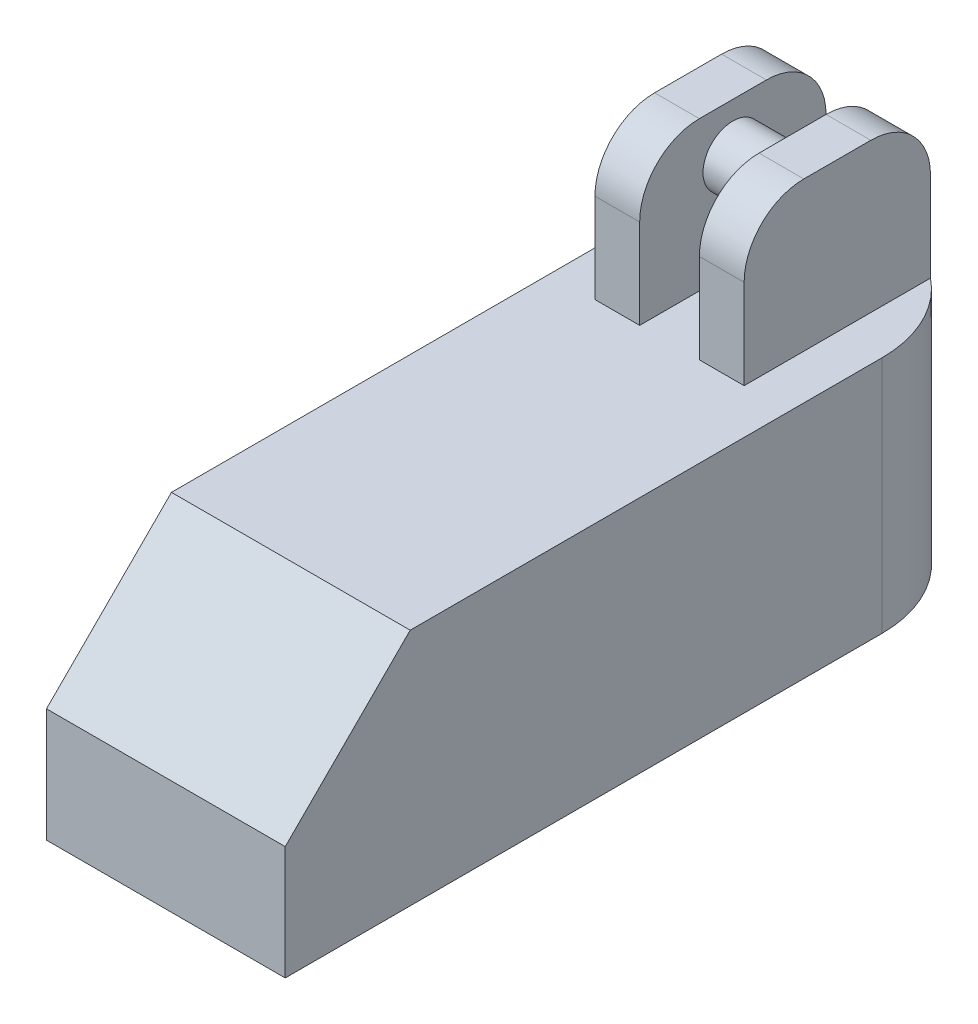
ISO-10303-21;
HEADER;
FILE_DESCRIPTION(('STEP AP214'),'2;1');
FILE_NAME('part.step','',(''),(''),'','','');
FILE_SCHEMA(('AUTOMOTIVE_DESIGN { 1 0 10303 214 1 1 1 1 }'));
ENDSEC;
DATA;
#1=APPLICATION_CONTEXT('core data for automotive mechanical design processes');
#2=APPLICATION_PROTOCOL_DEFINITION('international standard','automotive_design',2000,#1);
#3=PRODUCT_CONTEXT('',#1,'mechanical');
#4=PRODUCT('Part','Part','',(#3));
#5=PRODUCT_RELATED_PRODUCT_CATEGORY('part','',(#4));
#6=PRODUCT_DEFINITION_FORMATION('','',#4);
#7=PRODUCT_DEFINITION_CONTEXT('part definition',#1,'design');
#8=PRODUCT_DEFINITION('design','',#6,#7);
#9=PRODUCT_DEFINITION_SHAPE('','',#8);
#10=(LENGTH_UNIT() NAMED_UNIT(*) SI_UNIT(.MILLI.,.METRE.));
#11=(NAMED_UNIT(*) PLANE_ANGLE_UNIT() SI_UNIT($,.RADIAN.));
#12=(NAMED_UNIT(*) SI_UNIT($,.STERADIAN.) SOLID_ANGLE_UNIT());
#13=UNCERTAINTY_MEASURE_WITH_UNIT(LENGTH_MEASURE(1.E-05),#10,'distance_accuracy_value','');
#14=(GEOMETRIC_REPRESENTATION_CONTEXT(3) GLOBAL_UNCERTAINTY_ASSIGNED_CONTEXT((#13)) GLOBAL_UNIT_ASSIGNED_CONTEXT((#10,
#11,#12)) REPRESENTATION_CONTEXT('',''));
#15=CARTESIAN_POINT('',(0.,0.,0.));
#16=DIRECTION('',(0.,0.,1.));
#17=DIRECTION('',(1.,0.,0.));
#18=AXIS2_PLACEMENT_3D('',#15,#16,#17);
#19=CARTESIAN_POINT('',(0.,203.2,0.));
#20=DIRECTION('',(0.,-1.,0.));
#21=DIRECTION('',(0.,0.,-1.));
#22=AXIS2_PLACEMENT_3D('',#19,#20,#21);
#23=CYLINDRICAL_SURFACE('',#22,50.8);
#24=CARTESIAN_POINT('',(0.,101.6,0.));
#25=DIRECTION('',(0.,1.,0.));
#26=DIRECTION('',(0.,0.,1.));
#27=AXIS2_PLACEMENT_3D('',#24,#25,#26);
#28=CIRCLE('',#27,50.8);
#29=CARTESIAN_POINT('',(50.8,101.6,0.));
#30=VERTEX_POINT('',#29);
#31=CARTESIAN_POINT('',(-50.8,101.6,0.));
#32=VERTEX_POINT('',#31);
#33=EDGE_CURVE('E166',#30,#32,#28,.T.);
#34=ORIENTED_EDGE('',*,*,#33,.T.);
#35=DIRECTION('',(0.,-1.,0.));
#36=VECTOR('',#35,1.);
#37=CARTESIAN_POINT('',(-50.8,203.2,0.));
#38=LINE('',#37,#36);
#39=CARTESIAN_POINT('',(-50.8,203.2,0.));
#40=VERTEX_POINT('',#39);
#41=EDGE_CURVE('E170',#40,#32,#38,.T.);
#42=ORIENTED_EDGE('',*,*,#41,.F.);
#43=CARTESIAN_POINT('',(0.,203.2,0.));
#44=DIRECTION('',(0.,1.,0.));
#45=DIRECTION('',(0.,0.,1.));
#46=AXIS2_PLACEMENT_3D('',#43,#44,#45);
#47=CIRCLE('',#46,50.8);
#48=CARTESIAN_POINT('',(-31.75,203.2,-39.6557372898298));
#49=VERTEX_POINT('',#48);
#50=EDGE_CURVE('E250',#49,#40,#47,.T.);
#51=ORIENTED_EDGE('',*,*,#50,.F.);
#52=CARTESIAN_POINT('',(31.75,203.2,-39.6557372898298));
#53=VERTEX_POINT('',#52);
#54=EDGE_CURVE('E255',#53,#49,#47,.T.);
#55=ORIENTED_EDGE('',*,*,#54,.F.);
#56=CARTESIAN_POINT('',(50.8,203.2,0.));
#57=VERTEX_POINT('',#56);
#58=EDGE_CURVE('E251',#57,#53,#47,.T.);
#59=ORIENTED_EDGE('',*,*,#58,.F.);
#60=DIRECTION('',(0.,1.,0.));
#61=VECTOR('',#60,1.);
#62=CARTESIAN_POINT('',(50.8,203.2,0.));
#63=LINE('',#62,#61);
#64=EDGE_CURVE('E174',#30,#57,#63,.T.);
#65=ORIENTED_EDGE('',*,*,#64,.F.);
#66=EDGE_LOOP('',(#34,#42,#51,#55,#59,#65));
#67=FACE_BOUND('',#66,.T.);
#68=ADVANCED_FACE('F47',(#67),#23,.T.);
#69=CARTESIAN_POINT('',(-31.75,266.7,-39.6557372898298));
#70=DIRECTION('',(0.,0.,1.));
#71=DIRECTION('',(1.,0.,0.));
#72=AXIS2_PLACEMENT_3D('',#69,#70,#71);
#73=PLANE('',#72);
#74=DIRECTION('',(0.,1.,0.));
#75=VECTOR('',#74,1.);
#76=CARTESIAN_POINT('',(12.7,203.2,-39.6557372898298));
#77=LINE('',#76,#75);
#78=CARTESIAN_POINT('',(12.7,203.2,-39.6557372898298));
#79=VERTEX_POINT('',#78);
#80=CARTESIAN_POINT('',(12.7,241.3,-39.6557372898298));
#81=VERTEX_POINT('',#80);
#82=EDGE_CURVE('E206',#79,#81,#77,.T.);
#83=ORIENTED_EDGE('',*,*,#82,.T.);
#84=DIRECTION('',(-1.,0.,0.));
#85=VECTOR('',#84,1.);
#86=CARTESIAN_POINT('',(-31.75,241.3,-39.6557372898298));
#87=LINE('',#86,#85);
#88=CARTESIAN_POINT('',(31.75,241.3,-39.6557372898298));
#89=VERTEX_POINT('',#88);
#90=EDGE_CURVE('E283',#81,#89,#87,.F.);
#91=ORIENTED_EDGE('',*,*,#90,.T.);
#92=DIRECTION('',(0.,-1.,0.));
#93=VECTOR('',#92,1.);
#94=CARTESIAN_POINT('',(31.75,266.7,-39.6557372898298));
#95=LINE('',#94,#93);
#96=EDGE_CURVE('E247',#89,#53,#95,.T.);
#97=ORIENTED_EDGE('',*,*,#96,.T.);
#98=DIRECTION('',(-1.,0.,0.));
#99=VECTOR('',#98,1.);
#100=CARTESIAN_POINT('',(-31.75,203.2,-39.6557372898298));
#101=LINE('',#100,#99);
#102=EDGE_CURVE('E233',#53,#79,#101,.T.);
#103=ORIENTED_EDGE('',*,*,#102,.T.);
#104=EDGE_LOOP('',(#83,#91,#97,#103));
#105=FACE_BOUND('',#104,.T.);
#106=ADVANCED_FACE('F359',(#105),#73,.F.);
#107=CARTESIAN_POINT('',(-31.75,266.7,39.6557372898298));
#108=DIRECTION('',(0.,0.,-1.));
#109=DIRECTION('',(-1.,0.,0.));
#110=AXIS2_PLACEMENT_3D('',#107,#108,#109);
#111=PLANE('',#110);
#112=DIRECTION('',(0.,-1.,0.));
#113=VECTOR('',#112,1.);
#114=CARTESIAN_POINT('',(31.75,266.7,39.6557372898298));
#115=LINE('',#114,#113);
#116=CARTESIAN_POINT('',(31.75,241.3,39.6557372898298));
#117=VERTEX_POINT('',#116);
#118=CARTESIAN_POINT('',(31.75,203.2,39.6557372898298));
#119=VERTEX_POINT('',#118);
#120=EDGE_CURVE('E230',#117,#119,#115,.T.);
#121=ORIENTED_EDGE('',*,*,#120,.F.);
#122=DIRECTION('',(1.,0.,0.));
#123=VECTOR('',#122,1.);
#124=CARTESIAN_POINT('',(-31.75,241.3,39.6557372898298));
#125=LINE('',#124,#123);
#126=CARTESIAN_POINT('',(12.7,241.3,39.6557372898298));
#127=VERTEX_POINT('',#126);
#128=EDGE_CURVE('E289',#117,#127,#125,.F.);
#129=ORIENTED_EDGE('',*,*,#128,.T.);
#130=DIRECTION('',(0.,1.,0.));
#131=VECTOR('',#130,1.);
#132=CARTESIAN_POINT('',(12.7,203.2,39.6557372898298));
#133=LINE('',#132,#131);
#134=CARTESIAN_POINT('',(12.7,203.2,39.6557372898298));
#135=VERTEX_POINT('',#134);
#136=EDGE_CURVE('E211',#135,#127,#133,.T.);
#137=ORIENTED_EDGE('',*,*,#136,.F.);
#138=DIRECTION('',(1.,0.,0.));
#139=VECTOR('',#138,1.);
#140=CARTESIAN_POINT('',(-31.75,203.2,39.6557372898298));
#141=LINE('',#140,#139);
#142=EDGE_CURVE('E238',#135,#119,#141,.T.);
#143=ORIENTED_EDGE('',*,*,#142,.T.);
#144=EDGE_LOOP('',(#121,#129,#137,#143));
#145=FACE_BOUND('',#144,.T.);
#146=ADVANCED_FACE('F348',(#145),#111,.F.);
#147=CARTESIAN_POINT('',(0.,266.7,0.));
#148=DIRECTION('',(0.,-1.,0.));
#149=DIRECTION('',(0.,0.,-1.));
#150=AXIS2_PLACEMENT_3D('',#147,#148,#149);
#151=PLANE('',#150);
#152=DIRECTION('',(0.,0.,-1.));
#153=VECTOR('',#152,1.);
#154=CARTESIAN_POINT('',(31.75,266.7,39.6557372898298));
#155=LINE('',#154,#153);
#156=CARTESIAN_POINT('',(31.75,266.7,14.2557372898298));
#157=VERTEX_POINT('',#156);
#158=CARTESIAN_POINT('',(31.75,266.7,-14.2557372898298));
#159=VERTEX_POINT('',#158);
#160=EDGE_CURVE('E223',#157,#159,#155,.T.);
#161=ORIENTED_EDGE('',*,*,#160,.T.);
#162=DIRECTION('',(-1.,0.,0.));
#163=VECTOR('',#162,1.);
#164=CARTESIAN_POINT('',(0.,266.7,-14.2557372898298));
#165=LINE('',#164,#163);
#166=CARTESIAN_POINT('',(12.7,266.7,-14.2557372898298));
#167=VERTEX_POINT('',#166);
#168=EDGE_CURVE('E276',#159,#167,#165,.T.);
#169=ORIENTED_EDGE('',*,*,#168,.T.);
#170=DIRECTION('',(0.,0.,-1.));
#171=VECTOR('',#170,1.);
#172=CARTESIAN_POINT('',(12.7,266.7,39.6557372898298));
#173=LINE('',#172,#171);
#174=CARTESIAN_POINT('',(12.7,266.7,14.2557372898298));
#175=VERTEX_POINT('',#174);
#176=EDGE_CURVE('E185',#175,#167,#173,.T.);
#177=ORIENTED_EDGE('',*,*,#176,.F.);
#178=DIRECTION('',(1.,0.,0.));
#179=VECTOR('',#178,1.);
#180=CARTESIAN_POINT('',(0.,266.7,14.2557372898298));
#181=LINE('',#180,#179);
#182=EDGE_CURVE('E273',#175,#157,#181,.T.);
#183=ORIENTED_EDGE('',*,*,#182,.T.);
#184=EDGE_LOOP('',(#161,#169,#177,#183));
#185=FACE_BOUND('',#184,.T.);
#186=ADVANCED_FACE('F336',(#185),#151,.F.);
#187=CARTESIAN_POINT('',(0.,203.2,0.));
#188=DIRECTION('',(0.,1.,0.));
#189=DIRECTION('',(0.,0.,1.));
#190=AXIS2_PLACEMENT_3D('',#187,#188,#189);
#191=PLANE('',#190);
#192=DIRECTION('',(0.,0.,-1.));
#193=VECTOR('',#192,1.);
#194=CARTESIAN_POINT('',(-50.8,203.2,254.));
#195=LINE('',#194,#193);
#196=CARTESIAN_POINT('',(-50.8,203.2,200.82));
#197=VERTEX_POINT('',#196);
#198=EDGE_CURVE('E189',#197,#40,#195,.T.);
#199=ORIENTED_EDGE('',*,*,#198,.F.);
#200=DIRECTION('',(1.,0.,0.));
#201=VECTOR('',#200,1.);
#202=CARTESIAN_POINT('',(0.,203.2,200.82));
#203=LINE('',#202,#201);
#204=CARTESIAN_POINT('',(50.8,203.2,200.82));
#205=VERTEX_POINT('',#204);
#206=EDGE_CURVE('E57',#197,#205,#203,.T.);
#207=ORIENTED_EDGE('',*,*,#206,.T.);
#208=DIRECTION('',(0.,0.,-1.));
#209=VECTOR('',#208,1.);
#210=CARTESIAN_POINT('',(50.8,203.2,254.));
#211=LINE('',#210,#209);
#212=EDGE_CURVE('E198',#205,#57,#211,.T.);
#213=ORIENTED_EDGE('',*,*,#212,.T.);
#214=ORIENTED_EDGE('',*,*,#58,.T.);
#215=DIRECTION('',(0.,0.,-1.));
#216=VECTOR('',#215,1.);
#217=CARTESIAN_POINT('',(31.75,203.2,39.6557372898298));
#218=LINE('',#217,#216);
#219=EDGE_CURVE('E214',#119,#53,#218,.T.);
#220=ORIENTED_EDGE('',*,*,#219,.F.);
#221=ORIENTED_EDGE('',*,*,#142,.F.);
#222=DIRECTION('',(0.,0.,-1.));
#223=VECTOR('',#222,1.);
#224=CARTESIAN_POINT('',(12.7,203.2,39.6557372898298));
#225=LINE('',#224,#223);
#226=EDGE_CURVE('E201',#135,#79,#225,.T.);
#227=ORIENTED_EDGE('',*,*,#226,.T.);
#228=ORIENTED_EDGE('',*,*,#102,.F.);
#229=ORIENTED_EDGE('',*,*,#54,.T.);
#230=CARTESIAN_POINT('',(-12.7,203.2,-39.6557372898298));
#231=VERTEX_POINT('',#230);
#232=EDGE_CURVE('E232',#231,#49,#101,.T.);
#233=ORIENTED_EDGE('',*,*,#232,.F.);
#234=DIRECTION('',(0.,0.,1.));
#235=VECTOR('',#234,1.);
#236=CARTESIAN_POINT('',(-12.7,203.2,39.6557372898298));
#237=LINE('',#236,#235);
#238=CARTESIAN_POINT('',(-12.7,203.2,39.6557372898298));
#239=VERTEX_POINT('',#238);
#240=EDGE_CURVE('E203',#231,#239,#237,.T.);
#241=ORIENTED_EDGE('',*,*,#240,.T.);
#242=CARTESIAN_POINT('',(-31.75,203.2,39.6557372898298));
#243=VERTEX_POINT('',#242);
#244=EDGE_CURVE('E227',#243,#239,#141,.T.);
#245=ORIENTED_EDGE('',*,*,#244,.F.);
#246=DIRECTION('',(0.,0.,1.));
#247=VECTOR('',#246,1.);
#248=CARTESIAN_POINT('',(-31.75,203.2,39.6557372898298));
#249=LINE('',#248,#247);
#250=EDGE_CURVE('E236',#49,#243,#249,.T.);
#251=ORIENTED_EDGE('',*,*,#250,.F.);
#252=ORIENTED_EDGE('',*,*,#50,.T.);
#253=EDGE_LOOP('',(#199,#207,#213,#214,#220,#221,#227,#228,#229,#233,#241,#245,#251,#252));
#254=FACE_BOUND('',#253,.T.);
#255=ADVANCED_FACE('F352',(#254),#191,.T.);
#256=CARTESIAN_POINT('',(31.75,266.7,39.6557372898298));
#257=DIRECTION('',(-1.,0.,0.));
#258=DIRECTION('',(0.,0.,1.));
#259=AXIS2_PLACEMENT_3D('',#256,#257,#258);
#260=PLANE('',#259);
#261=ORIENTED_EDGE('',*,*,#96,.F.);
#262=CARTESIAN_POINT('',(31.75,241.3,-14.2557372898298));
#263=DIRECTION('',(-1.,0.,0.));
#264=DIRECTION('',(0.,0.,1.));
#265=AXIS2_PLACEMENT_3D('',#262,#263,#264);
#266=CIRCLE('',#265,25.4);
#267=EDGE_CURVE('E287',#89,#159,#266,.F.);
#268=ORIENTED_EDGE('',*,*,#267,.T.);
#269=ORIENTED_EDGE('',*,*,#160,.F.);
#270=CARTESIAN_POINT('',(31.75,241.3,14.2557372898298));
#271=DIRECTION('',(-1.,0.,0.));
#272=DIRECTION('',(0.,0.,1.));
#273=AXIS2_PLACEMENT_3D('',#270,#271,#272);
#274=CIRCLE('',#273,25.4);
#275=EDGE_CURVE('E285',#157,#117,#274,.F.);
#276=ORIENTED_EDGE('',*,*,#275,.T.);
#277=ORIENTED_EDGE('',*,*,#120,.T.);
#278=ORIENTED_EDGE('',*,*,#219,.T.);
#279=EDGE_LOOP('',(#261,#268,#269,#276,#277,#278));
#280=FACE_BOUND('',#279,.T.);
#281=ADVANCED_FACE('F345',(#280),#260,.F.);
#282=DIRECTION('',(0.,-1.,0.));
#283=VECTOR('',#282,1.);
#284=CARTESIAN_POINT('',(-31.75,266.7,-39.6557372898298));
#285=LINE('',#284,#283);
#286=CARTESIAN_POINT('',(-31.75,241.3,-39.6557372898298));
#287=VERTEX_POINT('',#286);
#288=EDGE_CURVE('E245',#287,#49,#285,.T.);
#289=ORIENTED_EDGE('',*,*,#288,.F.);
#290=DIRECTION('',(-1.,0.,0.));
#291=VECTOR('',#290,1.);
#292=CARTESIAN_POINT('',(-31.75,241.3,-39.6557372898298));
#293=LINE('',#292,#291);
#294=CARTESIAN_POINT('',(-12.7,241.3,-39.6557372898298));
#295=VERTEX_POINT('',#294);
#296=EDGE_CURVE('E265',#287,#295,#293,.F.);
#297=ORIENTED_EDGE('',*,*,#296,.T.);
#298=DIRECTION('',(0.,1.,0.));
#299=VECTOR('',#298,1.);
#300=CARTESIAN_POINT('',(-12.7,203.2,-39.6557372898298));
#301=LINE('',#300,#299);
#302=EDGE_CURVE('E218',#231,#295,#301,.T.);
#303=ORIENTED_EDGE('',*,*,#302,.F.);
#304=ORIENTED_EDGE('',*,*,#232,.T.);
#305=EDGE_LOOP('',(#289,#297,#303,#304));
#306=FACE_BOUND('',#305,.T.);
#307=ADVANCED_FACE('F387',(#306),#73,.F.);
#308=CARTESIAN_POINT('',(-31.75,266.7,39.6557372898298));
#309=DIRECTION('',(1.,0.,0.));
#310=DIRECTION('',(0.,0.,-1.));
#311=AXIS2_PLACEMENT_3D('',#308,#309,#310);
#312=PLANE('',#311);
#313=DIRECTION('',(0.,0.,1.));
#314=VECTOR('',#313,1.);
#315=CARTESIAN_POINT('',(-31.75,266.7,39.6557372898298));
#316=LINE('',#315,#314);
#317=CARTESIAN_POINT('',(-31.75,266.7,-14.2557372898298));
#318=VERTEX_POINT('',#317);
#319=CARTESIAN_POINT('',(-31.75,266.7,14.2557372898298));
#320=VERTEX_POINT('',#319);
#321=EDGE_CURVE('E226',#318,#320,#316,.T.);
#322=ORIENTED_EDGE('',*,*,#321,.F.);
#323=CARTESIAN_POINT('',(-31.75,241.3,-14.2557372898298));
#324=DIRECTION('',(1.,0.,0.));
#325=DIRECTION('',(0.,0.,-1.));
#326=AXIS2_PLACEMENT_3D('',#323,#324,#325);
#327=CIRCLE('',#326,25.4);
#328=EDGE_CURVE('E263',#318,#287,#327,.F.);
#329=ORIENTED_EDGE('',*,*,#328,.T.);
#330=ORIENTED_EDGE('',*,*,#288,.T.);
#331=ORIENTED_EDGE('',*,*,#250,.T.);
#332=DIRECTION('',(0.,-1.,0.));
#333=VECTOR('',#332,1.);
#334=CARTESIAN_POINT('',(-31.75,266.7,39.6557372898298));
#335=LINE('',#334,#333);
#336=CARTESIAN_POINT('',(-31.75,241.3,39.6557372898298));
#337=VERTEX_POINT('',#336);
#338=EDGE_CURVE('E242',#337,#243,#335,.T.);
#339=ORIENTED_EDGE('',*,*,#338,.F.);
#340=CARTESIAN_POINT('',(-31.75,241.3,14.2557372898298));
#341=DIRECTION('',(1.,0.,0.));
#342=DIRECTION('',(0.,0.,-1.));
#343=AXIS2_PLACEMENT_3D('',#340,#341,#342);
#344=CIRCLE('',#343,25.4);
#345=EDGE_CURVE('E261',#337,#320,#344,.F.);
#346=ORIENTED_EDGE('',*,*,#345,.T.);
#347=EDGE_LOOP('',(#322,#329,#330,#331,#339,#346));
#348=FACE_BOUND('',#347,.T.);
#349=ADVANCED_FACE('F368',(#348),#312,.F.);
#350=DIRECTION('',(0.,1.,0.));
#351=VECTOR('',#350,1.);
#352=CARTESIAN_POINT('',(-12.7,203.2,39.6557372898298));
#353=LINE('',#352,#351);
#354=CARTESIAN_POINT('',(-12.7,241.3,39.6557372898298));
#355=VERTEX_POINT('',#354);
#356=EDGE_CURVE('E215',#239,#355,#353,.T.);
#357=ORIENTED_EDGE('',*,*,#356,.T.);
#358=DIRECTION('',(1.,0.,0.));
#359=VECTOR('',#358,1.);
#360=CARTESIAN_POINT('',(-31.75,241.3,39.6557372898298));
#361=LINE('',#360,#359);
#362=EDGE_CURVE('E271',#355,#337,#361,.F.);
#363=ORIENTED_EDGE('',*,*,#362,.T.);
#364=ORIENTED_EDGE('',*,*,#338,.T.);
#365=ORIENTED_EDGE('',*,*,#244,.T.);
#366=EDGE_LOOP('',(#357,#363,#364,#365));
#367=FACE_BOUND('',#366,.T.);
#368=ADVANCED_FACE('F373',(#367),#111,.F.);
#369=DIRECTION('',(0.,0.,1.));
#370=VECTOR('',#369,1.);
#371=CARTESIAN_POINT('',(-12.7,266.7,39.6557372898298));
#372=LINE('',#371,#370);
#373=CARTESIAN_POINT('',(-12.7,266.7,-14.2557372898298));
#374=VERTEX_POINT('',#373);
#375=CARTESIAN_POINT('',(-12.7,266.7,14.2557372898298));
#376=VERTEX_POINT('',#375);
#377=EDGE_CURVE('E204',#374,#376,#372,.T.);
#378=ORIENTED_EDGE('',*,*,#377,.F.);
#379=DIRECTION('',(-1.,0.,0.));
#380=VECTOR('',#379,1.);
#381=CARTESIAN_POINT('',(0.,266.7,-14.2557372898298));
#382=LINE('',#381,#380);
#383=EDGE_CURVE('E258',#374,#318,#382,.T.);
#384=ORIENTED_EDGE('',*,*,#383,.T.);
#385=ORIENTED_EDGE('',*,*,#321,.T.);
#386=DIRECTION('',(1.,0.,0.));
#387=VECTOR('',#386,1.);
#388=CARTESIAN_POINT('',(0.,266.7,14.2557372898298));
#389=LINE('',#388,#387);
#390=EDGE_CURVE('E254',#320,#376,#389,.T.);
#391=ORIENTED_EDGE('',*,*,#390,.T.);
#392=EDGE_LOOP('',(#378,#384,#385,#391));
#393=FACE_BOUND('',#392,.T.);
#394=ADVANCED_FACE('F329',(#393),#151,.F.);
#395=CARTESIAN_POINT('',(12.7,203.2,39.6557372898298));
#396=DIRECTION('',(1.,0.,0.));
#397=DIRECTION('',(0.,0.,-1.));
#398=AXIS2_PLACEMENT_3D('',#395,#396,#397);
#399=PLANE('',#398);
#400=CARTESIAN_POINT('',(12.7,245.99349704648,0.));
#401=DIRECTION('',(1.,0.,0.));
#402=DIRECTION('',(0.,0.,-1.));
#403=AXIS2_PLACEMENT_3D('',#400,#401,#402);
#404=CIRCLE('',#403,12.7);
#405=CARTESIAN_POINT('',(12.7,245.99349704648,-12.7));
#406=VERTEX_POINT('',#405);
#407=EDGE_CURVE('E178',#406,#406,#404,.T.);
#408=ORIENTED_EDGE('',*,*,#407,.T.);
#409=EDGE_LOOP('',(#408));
#410=FACE_BOUND('',#409,.T.);
#411=ORIENTED_EDGE('',*,*,#176,.T.);
#412=CARTESIAN_POINT('',(12.7,241.3,-14.2557372898298));
#413=DIRECTION('',(1.,0.,0.));
#414=DIRECTION('',(0.,0.,-1.));
#415=AXIS2_PLACEMENT_3D('',#412,#413,#414);
#416=CIRCLE('',#415,25.4);
#417=EDGE_CURVE('E281',#167,#81,#416,.F.);
#418=ORIENTED_EDGE('',*,*,#417,.T.);
#419=ORIENTED_EDGE('',*,*,#82,.F.);
#420=ORIENTED_EDGE('',*,*,#226,.F.);
#421=ORIENTED_EDGE('',*,*,#136,.T.);
#422=CARTESIAN_POINT('',(12.7,241.3,14.2557372898298));
#423=DIRECTION('',(1.,0.,0.));
#424=DIRECTION('',(0.,0.,-1.));
#425=AXIS2_PLACEMENT_3D('',#422,#423,#424);
#426=CIRCLE('',#425,25.4);
#427=EDGE_CURVE('E279',#127,#175,#426,.F.);
#428=ORIENTED_EDGE('',*,*,#427,.T.);
#429=EDGE_LOOP('',(#411,#418,#419,#420,#421,#428));
#430=FACE_BOUND('',#429,.T.);
#431=ADVANCED_FACE('F326',(#410,#430),#399,.F.);
#432=CARTESIAN_POINT('',(-12.7,203.2,39.6557372898298));
#433=DIRECTION('',(-1.,0.,0.));
#434=DIRECTION('',(0.,0.,1.));
#435=AXIS2_PLACEMENT_3D('',#432,#433,#434);
#436=PLANE('',#435);
#437=CARTESIAN_POINT('',(-12.7,245.99349704648,0.));
#438=DIRECTION('',(-1.,0.,0.));
#439=DIRECTION('',(0.,0.,1.));
#440=AXIS2_PLACEMENT_3D('',#437,#438,#439);
#441=CIRCLE('',#440,12.7);
#442=CARTESIAN_POINT('',(-12.7,245.99349704648,12.7));
#443=VERTEX_POINT('',#442);
#444=EDGE_CURVE('E52',#443,#443,#441,.T.);
#445=ORIENTED_EDGE('',*,*,#444,.T.);
#446=EDGE_LOOP('',(#445));
#447=FACE_BOUND('',#446,.T.);
#448=ORIENTED_EDGE('',*,*,#302,.T.);
#449=CARTESIAN_POINT('',(-12.7,241.3,-14.2557372898298));
#450=DIRECTION('',(-1.,0.,0.));
#451=DIRECTION('',(0.,0.,1.));
#452=AXIS2_PLACEMENT_3D('',#449,#450,#451);
#453=CIRCLE('',#452,25.4);
#454=EDGE_CURVE('E269',#295,#374,#453,.F.);
#455=ORIENTED_EDGE('',*,*,#454,.T.);
#456=ORIENTED_EDGE('',*,*,#377,.T.);
#457=CARTESIAN_POINT('',(-12.7,241.3,14.2557372898298));
#458=DIRECTION('',(-1.,0.,0.));
#459=DIRECTION('',(0.,0.,1.));
#460=AXIS2_PLACEMENT_3D('',#457,#458,#459);
#461=CIRCLE('',#460,25.4);
#462=EDGE_CURVE('E267',#376,#355,#461,.F.);
#463=ORIENTED_EDGE('',*,*,#462,.T.);
#464=ORIENTED_EDGE('',*,*,#356,.F.);
#465=ORIENTED_EDGE('',*,*,#240,.F.);
#466=EDGE_LOOP('',(#448,#455,#456,#463,#464,#465));
#467=FACE_BOUND('',#466,.T.);
#468=ADVANCED_FACE('F316',(#447,#467),#436,.F.);
#469=CARTESIAN_POINT('',(0.,241.3,-14.2557372898298));
#470=DIRECTION('',(-1.,0.,0.));
#471=DIRECTION('',(0.,0.,1.));
#472=AXIS2_PLACEMENT_3D('',#469,#470,#471);
#473=CYLINDRICAL_SURFACE('',#472,25.4);
#474=ORIENTED_EDGE('',*,*,#454,.F.);
#475=ORIENTED_EDGE('',*,*,#296,.F.);
#476=ORIENTED_EDGE('',*,*,#328,.F.);
#477=ORIENTED_EDGE('',*,*,#383,.F.);
#478=EDGE_LOOP('',(#474,#475,#476,#477));
#479=FACE_BOUND('',#478,.T.);
#480=ADVANCED_FACE('F384',(#479),#473,.T.);
#481=CARTESIAN_POINT('',(0.,241.3,14.2557372898298));
#482=DIRECTION('',(1.,0.,0.));
#483=DIRECTION('',(0.,0.,-1.));
#484=AXIS2_PLACEMENT_3D('',#481,#482,#483);
#485=CYLINDRICAL_SURFACE('',#484,25.4);
#486=ORIENTED_EDGE('',*,*,#345,.F.);
#487=ORIENTED_EDGE('',*,*,#362,.F.);
#488=ORIENTED_EDGE('',*,*,#462,.F.);
#489=ORIENTED_EDGE('',*,*,#390,.F.);
#490=EDGE_LOOP('',(#486,#487,#488,#489));
#491=FACE_BOUND('',#490,.T.);
#492=ADVANCED_FACE('F377',(#491),#485,.T.);
#493=CARTESIAN_POINT('',(0.,241.3,-14.2557372898298));
#494=DIRECTION('',(-1.,0.,0.));
#495=DIRECTION('',(0.,0.,1.));
#496=AXIS2_PLACEMENT_3D('',#493,#494,#495);
#497=CYLINDRICAL_SURFACE('',#496,25.4);
#498=ORIENTED_EDGE('',*,*,#267,.F.);
#499=ORIENTED_EDGE('',*,*,#90,.F.);
#500=ORIENTED_EDGE('',*,*,#417,.F.);
#501=ORIENTED_EDGE('',*,*,#168,.F.);
#502=EDGE_LOOP('',(#498,#499,#500,#501));
#503=FACE_BOUND('',#502,.T.);
#504=ADVANCED_FACE('F358',(#503),#497,.T.);
#505=CARTESIAN_POINT('',(0.,241.3,14.2557372898298));
#506=DIRECTION('',(1.,0.,0.));
#507=DIRECTION('',(0.,0.,-1.));
#508=AXIS2_PLACEMENT_3D('',#505,#506,#507);
#509=CYLINDRICAL_SURFACE('',#508,25.4);
#510=ORIENTED_EDGE('',*,*,#427,.F.);
#511=ORIENTED_EDGE('',*,*,#128,.F.);
#512=ORIENTED_EDGE('',*,*,#275,.F.);
#513=ORIENTED_EDGE('',*,*,#182,.F.);
#514=EDGE_LOOP('',(#510,#511,#512,#513));
#515=FACE_BOUND('',#514,.T.);
#516=ADVANCED_FACE('F340',(#515),#509,.T.);
#517=CARTESIAN_POINT('',(-50.8,203.2,254.));
#518=DIRECTION('',(1.,0.,0.));
#519=DIRECTION('',(0.,0.,-1.));
#520=AXIS2_PLACEMENT_3D('',#517,#518,#519);
#521=PLANE('',#520);
#522=DIRECTION('',(0.,-1.,0.));
#523=VECTOR('',#522,1.);
#524=CARTESIAN_POINT('',(-50.8,203.2,254.));
#525=LINE('',#524,#523);
#526=CARTESIAN_POINT('',(-50.8,150.02,254.));
#527=VERTEX_POINT('',#526);
#528=CARTESIAN_POINT('',(-50.8,101.6,254.));
#529=VERTEX_POINT('',#528);
#530=EDGE_CURVE('E191',#527,#529,#525,.T.);
#531=ORIENTED_EDGE('',*,*,#530,.F.);
#532=DIRECTION('',(0.,-0.707106781186548,0.707106781186548));
#533=VECTOR('',#532,1.);
#534=CARTESIAN_POINT('',(-50.8,150.02,254.));
#535=LINE('',#534,#533);
#536=EDGE_CURVE('E71',#527,#197,#535,.F.);
#537=ORIENTED_EDGE('',*,*,#536,.T.);
#538=ORIENTED_EDGE('',*,*,#198,.T.);
#539=ORIENTED_EDGE('',*,*,#41,.T.);
#540=DIRECTION('',(0.,0.,-1.));
#541=VECTOR('',#540,1.);
#542=CARTESIAN_POINT('',(-50.8,101.6,254.));
#543=LINE('',#542,#541);
#544=EDGE_CURVE('E182',#529,#32,#543,.T.);
#545=ORIENTED_EDGE('',*,*,#544,.F.);
#546=EDGE_LOOP('',(#531,#537,#538,#539,#545));
#547=FACE_BOUND('',#546,.T.);
#548=ADVANCED_FACE('F188',(#547),#521,.F.);
#549=CARTESIAN_POINT('',(-50.8,101.6,254.));
#550=DIRECTION('',(0.,1.,0.));
#551=DIRECTION('',(0.,0.,1.));
#552=AXIS2_PLACEMENT_3D('',#549,#550,#551);
#553=PLANE('',#552);
#554=CARTESIAN_POINT('',(0.,101.6,127.));
#555=DIRECTION('',(0.,-1.,0.));
#556=DIRECTION('',(0.,0.,-1.));
#557=AXIS2_PLACEMENT_3D('',#554,#555,#556);
#558=CIRCLE('',#557,38.1);
#559=CARTESIAN_POINT('',(0.,101.6,88.9));
#560=VERTEX_POINT('',#559);
#561=EDGE_CURVE('E306',#560,#560,#558,.T.);
#562=ORIENTED_EDGE('',*,*,#561,.F.);
#563=EDGE_LOOP('',(#562));
#564=FACE_BOUND('',#563,.T.);
#565=ORIENTED_EDGE('',*,*,#544,.T.);
#566=ORIENTED_EDGE('',*,*,#33,.F.);
#567=DIRECTION('',(0.,0.,-1.));
#568=VECTOR('',#567,1.);
#569=CARTESIAN_POINT('',(50.8,101.6,254.));
#570=LINE('',#569,#568);
#571=CARTESIAN_POINT('',(50.8,101.6,254.));
#572=VERTEX_POINT('',#571);
#573=EDGE_CURVE('E186',#572,#30,#570,.T.);
#574=ORIENTED_EDGE('',*,*,#573,.F.);
#575=DIRECTION('',(1.,0.,0.));
#576=VECTOR('',#575,1.);
#577=CARTESIAN_POINT('',(-50.8,101.6,254.));
#578=LINE('',#577,#576);
#579=EDGE_CURVE('E184',#529,#572,#578,.T.);
#580=ORIENTED_EDGE('',*,*,#579,.F.);
#581=EDGE_LOOP('',(#565,#566,#574,#580));
#582=FACE_BOUND('',#581,.T.);
#583=ADVANCED_FACE('F183',(#564,#582),#553,.F.);
#584=CARTESIAN_POINT('',(50.8,203.2,254.));
#585=DIRECTION('',(-1.,0.,0.));
#586=DIRECTION('',(0.,0.,1.));
#587=AXIS2_PLACEMENT_3D('',#584,#585,#586);
#588=PLANE('',#587);
#589=ORIENTED_EDGE('',*,*,#212,.F.);
#590=DIRECTION('',(0.,0.707106781186548,-0.707106781186548));
#591=VECTOR('',#590,1.);
#592=CARTESIAN_POINT('',(50.8,150.02,254.));
#593=LINE('',#592,#591);
#594=CARTESIAN_POINT('',(50.8,150.02,254.));
#595=VERTEX_POINT('',#594);
#596=EDGE_CURVE('E11',#205,#595,#593,.F.);
#597=ORIENTED_EDGE('',*,*,#596,.T.);
#598=DIRECTION('',(0.,1.,0.));
#599=VECTOR('',#598,1.);
#600=CARTESIAN_POINT('',(50.8,203.2,254.));
#601=LINE('',#600,#599);
#602=EDGE_CURVE('E194',#572,#595,#601,.T.);
#603=ORIENTED_EDGE('',*,*,#602,.F.);
#604=ORIENTED_EDGE('',*,*,#573,.T.);
#605=ORIENTED_EDGE('',*,*,#64,.T.);
#606=EDGE_LOOP('',(#589,#597,#603,#604,#605));
#607=FACE_BOUND('',#606,.T.);
#608=ADVANCED_FACE('F419',(#607),#588,.F.);
#609=CARTESIAN_POINT('',(0.,0.,254.));
#610=DIRECTION('',(0.,0.,1.));
#611=DIRECTION('',(1.,0.,0.));
#612=AXIS2_PLACEMENT_3D('',#609,#610,#611);
#613=PLANE('',#612);
#614=ORIENTED_EDGE('',*,*,#602,.T.);
#615=DIRECTION('',(-1.,0.,0.));
#616=VECTOR('',#615,1.);
#617=CARTESIAN_POINT('',(0.,150.02,254.));
#618=LINE('',#617,#616);
#619=EDGE_CURVE('E291',#595,#527,#618,.T.);
#620=ORIENTED_EDGE('',*,*,#619,.T.);
#621=ORIENTED_EDGE('',*,*,#530,.T.);
#622=ORIENTED_EDGE('',*,*,#579,.T.);
#623=EDGE_LOOP('',(#614,#620,#621,#622));
#624=FACE_BOUND('',#623,.T.);
#625=ADVANCED_FACE('F298',(#624),#613,.T.);
#626=CARTESIAN_POINT('',(0.,150.02,254.));
#627=DIRECTION('',(0.,-0.707106781186548,-0.707106781186548));
#628=DIRECTION('',(-1.,0.,0.));
#629=AXIS2_PLACEMENT_3D('',#626,#627,#628);
#630=PLANE('',#629);
#631=ORIENTED_EDGE('',*,*,#596,.F.);
#632=ORIENTED_EDGE('',*,*,#206,.F.);
#633=ORIENTED_EDGE('',*,*,#536,.F.);
#634=ORIENTED_EDGE('',*,*,#619,.F.);
#635=EDGE_LOOP('',(#631,#632,#633,#634));
#636=FACE_BOUND('',#635,.T.);
#637=ADVANCED_FACE('F50',(#636),#630,.F.);
#638=CARTESIAN_POINT('',(-21.59,245.99349704648,0.));
#639=DIRECTION('',(1.,0.,0.));
#640=DIRECTION('',(0.,0.,-1.));
#641=AXIS2_PLACEMENT_3D('',#638,#639,#640);
#642=CYLINDRICAL_SURFACE('',#641,12.7);
#643=ORIENTED_EDGE('',*,*,#444,.F.);
#644=EDGE_LOOP('',(#643));
#645=FACE_BOUND('',#644,.T.);
#646=ORIENTED_EDGE('',*,*,#407,.F.);
#647=EDGE_LOOP('',(#646));
#648=FACE_BOUND('',#647,.T.);
#649=ADVANCED_FACE('F319',(#645,#648),#642,.T.);
#650=CARTESIAN_POINT('',(0.,152.4,127.));
#651=DIRECTION('',(0.,-1.,0.));
#652=DIRECTION('',(0.,0.,-1.));
#653=AXIS2_PLACEMENT_3D('',#650,#651,#652);
#654=CYLINDRICAL_SURFACE('',#653,38.1);
#655=CARTESIAN_POINT('',(0.,152.4,127.));
#656=DIRECTION('',(0.,-1.,0.));
#657=DIRECTION('',(0.,0.,-1.));
#658=AXIS2_PLACEMENT_3D('',#655,#656,#657);
#659=CIRCLE('',#658,38.1);
#660=CARTESIAN_POINT('',(0.,152.4,88.9));
#661=VERTEX_POINT('',#660);
#662=EDGE_CURVE('E309',#661,#661,#659,.T.);
#663=ORIENTED_EDGE('',*,*,#662,.F.);
#664=EDGE_LOOP('',(#663));
#665=FACE_BOUND('',#664,.T.);
#666=ORIENTED_EDGE('',*,*,#561,.T.);
#667=EDGE_LOOP('',(#666));
#668=FACE_BOUND('',#667,.T.);
#669=ADVANCED_FACE('F322',(#665,#668),#654,.F.);
#670=CARTESIAN_POINT('',(0.,152.4,127.));
#671=DIRECTION('',(0.,-1.,0.));
#672=DIRECTION('',(0.,0.,-1.));
#673=AXIS2_PLACEMENT_3D('',#670,#671,#672);
#674=PLANE('',#673);
#675=ORIENTED_EDGE('',*,*,#662,.T.);
#676=EDGE_LOOP('',(#675));
#677=FACE_BOUND('',#676,.T.);
#678=ADVANCED_FACE('F429',(#677),#674,.T.);
#679=CLOSED_SHELL('',(#68,#106,#146,#186,#255,#281,#307,#349,#368,#394,#431,#468,#480,#492,#504,
#516,#548,#583,#608,#625,#637,#649,#669,#678));
#680=MANIFOLD_SOLID_BREP('B2',#679);
#681=ADVANCED_BREP_SHAPE_REPRESENTATION('',(#18,#680),#14);
#682=SHAPE_DEFINITION_REPRESENTATION(#9,#681);
ENDSEC;
END-ISO-10303-21;
